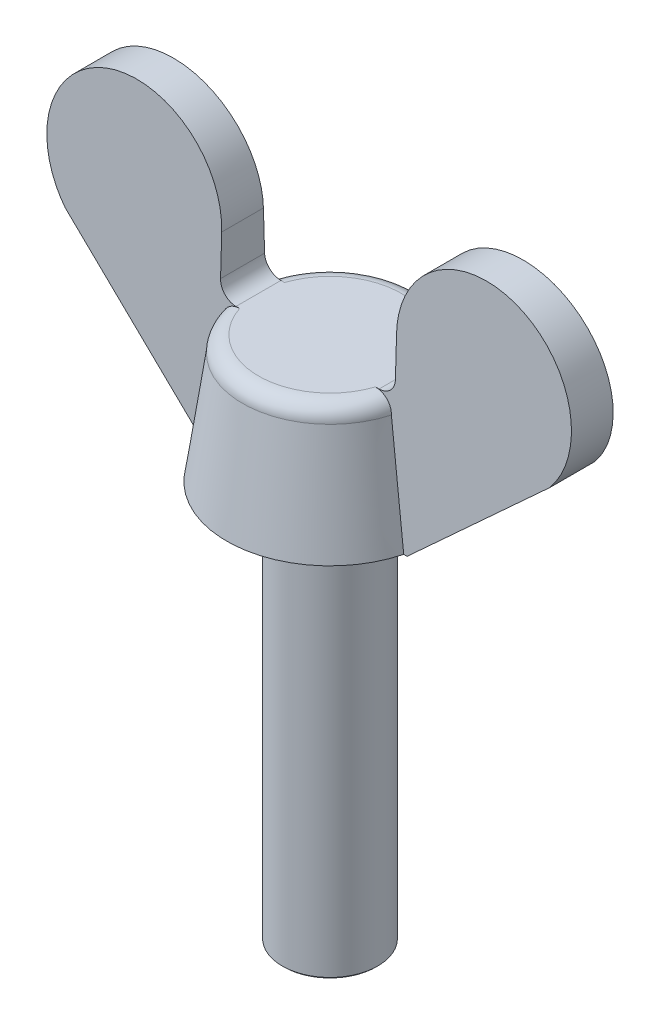
ISO-10303-21;
HEADER;
FILE_DESCRIPTION(('STEP AP214'),'2;1');
FILE_NAME('part.step','',(''),(''),'','','');
FILE_SCHEMA(('AUTOMOTIVE_DESIGN { 1 0 10303 214 1 1 1 1 }'));
ENDSEC;
DATA;
#1=APPLICATION_CONTEXT('core data for automotive mechanical design processes');
#2=APPLICATION_PROTOCOL_DEFINITION('international standard','automotive_design',2000,#1);
#3=PRODUCT_CONTEXT('',#1,'mechanical');
#4=PRODUCT('Part','Part','',(#3));
#5=PRODUCT_RELATED_PRODUCT_CATEGORY('part','',(#4));
#6=PRODUCT_DEFINITION_FORMATION('','',#4);
#7=PRODUCT_DEFINITION_CONTEXT('part definition',#1,'design');
#8=PRODUCT_DEFINITION('design','',#6,#7);
#9=PRODUCT_DEFINITION_SHAPE('','',#8);
#10=(LENGTH_UNIT() NAMED_UNIT(*) SI_UNIT(.MILLI.,.METRE.));
#11=(NAMED_UNIT(*) PLANE_ANGLE_UNIT() SI_UNIT($,.RADIAN.));
#12=(NAMED_UNIT(*) SI_UNIT($,.STERADIAN.) SOLID_ANGLE_UNIT());
#13=UNCERTAINTY_MEASURE_WITH_UNIT(LENGTH_MEASURE(1.E-05),#10,'distance_accuracy_value','');
#14=(GEOMETRIC_REPRESENTATION_CONTEXT(3) GLOBAL_UNCERTAINTY_ASSIGNED_CONTEXT((#13)) GLOBAL_UNIT_ASSIGNED_CONTEXT((#10,
#11,#12)) REPRESENTATION_CONTEXT('',''));
#15=CARTESIAN_POINT('',(0.,0.,0.));
#16=DIRECTION('',(0.,0.,1.));
#17=DIRECTION('',(1.,0.,0.));
#18=AXIS2_PLACEMENT_3D('',#15,#16,#17);
#19=CARTESIAN_POINT('',(81.,0.,1.65));
#20=DIRECTION('',(0.,0.0293990516018927,0.999567754464353));
#21=DIRECTION('',(0.,-0.999567754464353,0.0293990516018927));
#22=AXIS2_PLACEMENT_3D('',#19,#20,#21);
#23=PLANE('',#22);
#24=CARTESIAN_POINT('',(3.1881824558515,6.9998,1.44412352941176));
#25=CARTESIAN_POINT('',(3.18853224174816,7.02661716749052,1.44333478919146));
#26=CARTESIAN_POINT('',(3.19006951417628,7.05340413208405,1.44254693729165));
#27=CARTESIAN_POINT('',(3.19547818428535,7.10673208554267,1.44097846807227));
#28=CARTESIAN_POINT('',(3.19934873578166,7.13327316004062,1.4401978482341));
#29=CARTESIAN_POINT('',(3.21435482144723,7.2120374101705,1.43788125264204));
#30=CARTESIAN_POINT('',(3.22888882277439,7.26365033539848,1.43636322542946));
#31=CARTESIAN_POINT('',(3.26629673931846,7.36364973405854,1.43342206664534));
#32=CARTESIAN_POINT('',(3.28916221836342,7.41203941282269,1.43199884079933));
#33=CARTESIAN_POINT('',(3.34231369198613,7.50459257667373,1.42927668892136));
#34=CARTESIAN_POINT('',(3.37260551931192,7.54875270171744,1.42797786171419));
#35=CARTESIAN_POINT('',(3.44129227300287,7.63405013705859,1.42546911361592));
#36=CARTESIAN_POINT('',(3.48002264660304,7.67491695116253,1.42426714849522));
#37=CARTESIAN_POINT('',(3.56333822362803,7.75016710448419,1.42205390869164));
#38=CARTESIAN_POINT('',(3.60792512477359,7.78454855662392,1.42104268951106));
#39=CARTESIAN_POINT('',(3.70554533084808,7.84866897993424,1.41915679470782));
#40=CARTESIAN_POINT('',(3.75896919732957,7.87781491440561,1.41829956134101));
#41=CARTESIAN_POINT('',(3.86980716863923,7.92716021027062,1.41684822910969));
#42=CARTESIAN_POINT('',(3.92722225445927,7.94735736310653,1.41625419520275));
#43=CARTESIAN_POINT('',(4.0470686513781,7.97895274223393,1.41532491934606));
#44=CARTESIAN_POINT('',(4.1096094731295,7.9899382235106,1.41500181695557));
#45=CARTESIAN_POINT('',(4.23565815845193,8.00120184956041,1.41467053383646));
#46=CARTESIAN_POINT('',(4.299166066538,8.00147949995186,1.41466236764847));
#47=CARTESIAN_POINT('',(4.42493290631509,7.99115255189533,1.41496610141484));
#48=CARTESIAN_POINT('',(4.48719693086758,7.9806107480636,1.41527615446872));
#49=CARTESIAN_POINT('',(4.60892890647733,7.94880694123468,1.41621156055192));
#50=CARTESIAN_POINT('',(4.66839741390458,7.92754708132839,1.41683685054917));
#51=CARTESIAN_POINT('',(4.78038509640124,7.87573171784828,1.41836083182799));
#52=CARTESIAN_POINT('',(4.83308301014985,7.84556257183039,1.41924815965205));
#53=CARTESIAN_POINT('',(4.93232553203143,7.77640054192969,1.42128233700207));
#54=CARTESIAN_POINT('',(4.97887216203762,7.73741056886024,1.42242910091588));
#55=CARTESIAN_POINT('',(5.06218311947123,7.65369279417373,1.42489138840666));
#56=CARTESIAN_POINT('',(5.09930292225529,7.60931824942709,1.42619652207567));
#57=CARTESIAN_POINT('',(5.16522696481788,7.51474868299915,1.42897797991179));
#58=CARTESIAN_POINT('',(5.1940303029339,7.46455303102571,1.43045432261689));
#59=CARTESIAN_POINT('',(5.24141435704506,7.36179948746624,1.43347648566276));
#60=CARTESIAN_POINT('',(5.2603315691564,7.30939598820326,1.43501776505285));
#61=CARTESIAN_POINT('',(5.28886385190192,7.20216858984727,1.43817151206332));
#62=CARTESIAN_POINT('',(5.29849545162545,7.14734917391371,1.43978384782607));
#63=CARTESIAN_POINT('',(5.30470289489283,7.07681917653468,1.44185825951369));
#64=CARTESIAN_POINT('',(5.30568481702064,7.06141908239086,1.44231120345909));
#65=CARTESIAN_POINT('',(5.30690771320516,7.03061370516241,1.44321724396581));
#66=CARTESIAN_POINT('',(5.30714984755576,7.01520846814245,1.44367033917228));
#67=CARTESIAN_POINT('',(5.30702430857438,6.9998,1.44412352941176));
#68=B_SPLINE_CURVE_WITH_KNOTS('',3,(#24,#25,#26,#27,#28,#29,#30,#31,#32,#33,#34,#35,#36,#37,#38,
#39,#40,#41,#42,#43,#44,#45,#46,#47,#48,#49,#50,#51,#52,#53,#54,#55,#56,#57,#58,#59,#60,#61,#62,
#63,#64,#65,#66,#67),.UNSPECIFIED.,.F.,.F.,(4,2,2,2,2,2,2,2,2,2,2,2,2,2,2,2,2,2,2,2,2,4),(0.,
0.0804388261072363,0.16084849788538,0.320931392023232,0.480852640066109,0.64089989695626,
0.809140830086143,0.977430641855624,1.15921011888466,1.34103443410065,1.53062619943046,
1.72022671822182,1.90873301050127,2.09720162561377,2.27846658500375,2.45967181520641,
2.63240959511594,2.80516609605091,2.97157985926963,3.1376968434859,3.18399950755751,
3.2302295124811),.UNSPECIFIED.);
#69=CARTESIAN_POINT('',(4.27183886241464,8.,1.41470588235294));
#70=VERTEX_POINT('',#69);
#71=CARTESIAN_POINT('',(5.30702592997747,7.,1.44411764705882));
#72=VERTEX_POINT('',#71);
#73=EDGE_CURVE('E258',#70,#72,#68,.T.);
#74=ORIENTED_EDGE('',*,*,#73,.T.);
#75=CARTESIAN_POINT('',(5.30699792030674,7.0002,1.44411176470588));
#76=CARTESIAN_POINT('',(5.47039233239155,5.83347241255833,1.47842728198358));
#77=CARTESIAN_POINT('',(5.63376620691693,4.66674195215578,1.51274288376012));
#78=CARTESIAN_POINT('',(5.96047288084039,2.33327528548912,1.58137425630914));
#79=CARTESIAN_POINT('',(6.12380568023849,1.166539079225,1.61569002708162));
#80=CARTESIAN_POINT('',(6.28711794207715,-0.000200000000000021,1.65000588235294));
#81=B_SPLINE_CURVE_WITH_KNOTS('',3,(#75,#76,#77,#78,#79,#80),.UNSPECIFIED.,.F.,.F.,(4,2,4),(0.,
3.53583893237585,7.07167786456925),.UNSPECIFIED.);
#82=CARTESIAN_POINT('',(6.28708994686731,0.,1.65));
#83=VERTEX_POINT('',#82);
#84=EDGE_CURVE('E281',#72,#83,#81,.T.);
#85=ORIENTED_EDGE('',*,*,#84,.T.);
#86=DIRECTION('',(1.,0.,0.));
#87=VECTOR('',#86,1.);
#88=CARTESIAN_POINT('',(-6.5,0.,1.65));
#89=LINE('',#88,#87);
#90=CARTESIAN_POINT('',(6.50000000000001,0.,1.65));
#91=VERTEX_POINT('',#90);
#92=EDGE_CURVE('E188',#83,#91,#89,.T.);
#93=ORIENTED_EDGE('',*,*,#92,.T.);
#94=DIRECTION('',(-0.737600612967388,-0.674945375764199,0.0198513345813));
#95=VECTOR('',#94,1.);
#96=CARTESIAN_POINT('',(6.54831977663278,0.0442152693787079,1.64869955090063));
#97=LINE('',#96,#95);
#98=CARTESIAN_POINT('',(15.2426406871193,8.,1.41470588235294));
#99=VERTEX_POINT('',#98);
#100=EDGE_CURVE('E288',#99,#91,#97,.T.);
#101=ORIENTED_EDGE('',*,*,#100,.F.);
#102=CARTESIAN_POINT('',(11.,11.5,1.31176470588235));
#103=DIRECTION('',(0.,0.0293990516018927,0.999567754464353));
#104=DIRECTION('',(0.,-0.999567754464353,0.0293990516018927));
#105=AXIS2_PLACEMENT_3D('',#102,#103,#104);
#106=ELLIPSE('',#105,5.50237837848954,5.5);
#107=CARTESIAN_POINT('',(5.5,11.5,1.31176470588235));
#108=VERTEX_POINT('',#107);
#109=EDGE_CURVE('E291',#108,#99,#106,.F.);
#110=ORIENTED_EDGE('',*,*,#109,.F.);
#111=DIRECTION('',(0.,0.999567754464353,-0.0293990516018927));
#112=VECTOR('',#111,1.);
#113=CARTESIAN_POINT('',(5.5,9.08919619706137,1.38267070008643));
#114=LINE('',#113,#112);
#115=CARTESIAN_POINT('',(5.5,9.,1.38529411764706));
#116=VERTEX_POINT('',#115);
#117=EDGE_CURVE('E293',#116,#108,#114,.T.);
#118=ORIENTED_EDGE('',*,*,#117,.F.);
#119=CARTESIAN_POINT('',(4.5,9.,1.38529411764706));
#120=DIRECTION('',(0.,0.0293990516018927,0.999567754464353));
#121=DIRECTION('',(0.,-0.999567754464353,0.0293990516018927));
#122=AXIS2_PLACEMENT_3D('',#119,#120,#121);
#123=ELLIPSE('',#122,1.00043243245264,1.);
#124=CARTESIAN_POINT('',(4.5,8.,1.41470588235294));
#125=VERTEX_POINT('',#124);
#126=EDGE_CURVE('E296',#125,#116,#123,.T.);
#127=ORIENTED_EDGE('',*,*,#126,.F.);
#128=DIRECTION('',(1.,0.,0.));
#129=VECTOR('',#128,1.);
#130=CARTESIAN_POINT('',(-4.5,8.,1.41470588235294));
#131=LINE('',#130,#129);
#132=EDGE_CURVE('E299',#70,#125,#131,.T.);
#133=ORIENTED_EDGE('',*,*,#132,.F.);
#134=EDGE_LOOP('',(#74,#85,#93,#101,#110,#118,#127,#133));
#135=FACE_BOUND('',#134,.T.);
#136=ADVANCED_FACE('F35',(#135),#23,.T.);
#137=CARTESIAN_POINT('',(-6.5,0.,1.65));
#138=VERTEX_POINT('',#137);
#139=CARTESIAN_POINT('',(-6.28708994686731,0.,1.65));
#140=VERTEX_POINT('',#139);
#141=EDGE_CURVE('E189',#138,#140,#89,.T.);
#142=ORIENTED_EDGE('',*,*,#141,.T.);
#143=CARTESIAN_POINT('',(-6.28711794207715,-0.000199999999999969,1.65000588235294));
#144=CARTESIAN_POINT('',(-6.12380568023849,1.166539079225,1.61569002708162));
#145=CARTESIAN_POINT('',(-5.96047288084039,2.33327528548912,1.58137425630914));
#146=CARTESIAN_POINT('',(-5.63376620691693,4.66674195215578,1.51274288376012));
#147=CARTESIAN_POINT('',(-5.47039233239155,5.83347241255833,1.47842728198358));
#148=CARTESIAN_POINT('',(-5.30699792030674,7.0002,1.44411176470588));
#149=B_SPLINE_CURVE_WITH_KNOTS('',3,(#143,#144,#145,#146,#147,#148),.UNSPECIFIED.,.F.,.F.,(4,2,
4),(0.,3.5358389321934,7.07167786456925),.UNSPECIFIED.);
#150=CARTESIAN_POINT('',(-5.30702592997747,7.,1.44411764705882));
#151=VERTEX_POINT('',#150);
#152=EDGE_CURVE('E275',#140,#151,#149,.T.);
#153=ORIENTED_EDGE('',*,*,#152,.T.);
#154=CARTESIAN_POINT('',(-5.30702430857437,6.9998,1.44412352941176));
#155=CARTESIAN_POINT('',(-5.30724822155936,7.02704538757067,1.44332219448322));
#156=CARTESIAN_POINT('',(-5.30631675640262,7.05428730053191,1.44252096174906));
#157=CARTESIAN_POINT('',(-5.30215313245408,7.10859283033787,1.44092374028418));
#158=CARTESIAN_POINT('',(-5.29892114294335,7.13565646015346,1.44012775117196));
#159=CARTESIAN_POINT('',(-5.28580882617285,7.21620885316993,1.43775856314206));
#160=CARTESIAN_POINT('',(-5.27251303868963,7.26918232440762,1.43620051987036));
#161=CARTESIAN_POINT('',(-5.23721711692032,7.37213445454747,1.43317251604272));
#162=CARTESIAN_POINT('',(-5.21521400842853,7.42211208342026,1.43170258578176));
#163=CARTESIAN_POINT('',(-5.16319799136727,7.51770998396949,1.42889088282443));
#164=CARTESIAN_POINT('',(-5.13318557936404,7.56333052554158,1.42754910218995));
#165=CARTESIAN_POINT('',(-5.06577669444156,7.64940141902572,1.42501760532277));
#166=CARTESIAN_POINT('',(-5.02831669827438,7.68980198330832,1.42382935343211));
#167=CARTESIAN_POINT('',(-4.94731187498472,7.76396696770423,1.42164803036164));
#168=CARTESIAN_POINT('',(-4.90376553285838,7.79772973049491,1.42065500792662));
#169=CARTESIAN_POINT('',(-4.81047616677419,7.85875716816322,1.41886008328932));
#170=CARTESIAN_POINT('',(-4.76058769401038,7.885799493697,1.41806472077362));
#171=CARTESIAN_POINT('',(-4.65711708084103,7.93150892892624,1.41672032561982));
#172=CARTESIAN_POINT('',(-4.60353450704509,7.95017505399379,1.41617132194136));
#173=CARTESIAN_POINT('',(-4.49179645775212,7.97945147477945,1.41531025074178));
#174=CARTESIAN_POINT('',(-4.43354343359439,7.98968956916843,1.41500913031858));
#175=CARTESIAN_POINT('',(-4.31614921230927,8.00069462501283,1.41468545220551));
#176=CARTESIAN_POINT('',(-4.25700779401487,8.00145918754204,1.41466296507229));
#177=CARTESIAN_POINT('',(-4.13673640479075,7.99348366301109,1.4148975393232));
#178=CARTESIAN_POINT('',(-4.07563432537529,7.98432125529662,1.41516702190304));
#179=CARTESIAN_POINT('',(-3.95573289416396,7.95617384162972,1.41599488701089));
#180=CARTESIAN_POINT('',(-3.89693403725041,7.93718673701054,1.4165533312644));
#181=CARTESIAN_POINT('',(-3.78157160150186,7.88921661446734,1.41796421722155));
#182=CARTESIAN_POINT('',(-3.72512051683333,7.85996249676563,1.41882463244807));
#183=CARTESIAN_POINT('',(-3.61798807915165,7.79229850880247,1.4208147497411));
#184=CARTESIAN_POINT('',(-3.56730698690792,7.75388822497918,1.4219444639712));
#185=CARTESIAN_POINT('',(-3.47395920784869,7.66930169788755,1.42443230300331));
#186=CARTESIAN_POINT('',(-3.43120608840716,7.62322106941652,1.4257876156054));
#187=CARTESIAN_POINT('',(-3.35466702951857,7.52408944666755,1.4287032515686));
#188=CARTESIAN_POINT('',(-3.32088087932315,7.4710386162523,1.43026357011023));
#189=CARTESIAN_POINT('',(-3.26576436032925,7.3631026788941,1.43343815650311));
#190=CARTESIAN_POINT('',(-3.24377286299784,7.30855475832377,1.43504250710812));
#191=CARTESIAN_POINT('',(-3.21029384759147,7.19639772130702,1.43834124349097));
#192=CARTESIAN_POINT('',(-3.19877796820996,7.13879731974358,1.44003537294872));
#193=CARTESIAN_POINT('',(-3.19146578562629,7.06727689657053,1.44213891480675));
#194=CARTESIAN_POINT('',(-3.19038960167874,7.05379380081313,1.44253547644667));
#195=CARTESIAN_POINT('',(-3.18883739326996,7.02681031623936,1.4433291083459));
#196=CARTESIAN_POINT('',(-3.18836060789386,7.01330997117073,1.44372617731851));
#197=CARTESIAN_POINT('',(-3.1881824558515,6.9998,1.44412352941176));
#198=B_SPLINE_CURVE_WITH_KNOTS('',3,(#154,#155,#156,#157,#158,#159,#160,#161,#162,#163,#164,
#165,#166,#167,#168,#169,#170,#171,#172,#173,#174,#175,#176,#177,#178,#179,#180,#181,#182,#183,
#184,#185,#186,#187,#188,#189,#190,#191,#192,#193,#194,#195,#196,#197),.UNSPECIFIED.,.F.,.F.,(4,
2,2,2,2,2,2,2,2,2,2,2,2,2,2,2,2,2,2,2,2,4),(0.,0.0817239877248246,0.163441962518638,
0.326512880593391,0.489639547809173,0.652756103735729,0.817328740779631,0.981942416190454,
1.15143687609292,1.32095125496548,1.4976016061514,1.67429668854283,1.8588150110601,
2.04337276506642,2.23322435412281,2.42308451994091,2.61073438818908,2.7983798457601,
2.9739617757746,3.14906691449766,3.1896547332393,3.23019097500923),.UNSPECIFIED.);
#199=CARTESIAN_POINT('',(-4.27183886241464,8.,1.41470588235294));
#200=VERTEX_POINT('',#199);
#201=EDGE_CURVE('E251',#151,#200,#198,.T.);
#202=ORIENTED_EDGE('',*,*,#201,.T.);
#203=CARTESIAN_POINT('',(-4.5,8.,1.41470588235294));
#204=VERTEX_POINT('',#203);
#205=EDGE_CURVE('E300',#204,#200,#131,.T.);
#206=ORIENTED_EDGE('',*,*,#205,.F.);
#207=CARTESIAN_POINT('',(-4.5,9.,1.38529411764706));
#208=DIRECTION('',(0.,0.0293990516018927,0.999567754464353));
#209=DIRECTION('',(0.,-0.999567754464353,0.0293990516018927));
#210=AXIS2_PLACEMENT_3D('',#207,#208,#209);
#211=ELLIPSE('',#210,1.00043243245264,1.);
#212=CARTESIAN_POINT('',(-5.5,9.,1.38529411764706));
#213=VERTEX_POINT('',#212);
#214=EDGE_CURVE('E302',#213,#204,#211,.T.);
#215=ORIENTED_EDGE('',*,*,#214,.F.);
#216=DIRECTION('',(0.,-0.999567754464353,0.0293990516018927));
#217=VECTOR('',#216,1.);
#218=CARTESIAN_POINT('',(-5.5,9.08919619706137,1.38267070008643));
#219=LINE('',#218,#217);
#220=CARTESIAN_POINT('',(-5.5,11.5,1.31176470588235));
#221=VERTEX_POINT('',#220);
#222=EDGE_CURVE('E305',#221,#213,#219,.T.);
#223=ORIENTED_EDGE('',*,*,#222,.F.);
#224=CARTESIAN_POINT('',(-11.,11.5,1.31176470588235));
#225=DIRECTION('',(0.,0.0293990516018927,0.999567754464353));
#226=DIRECTION('',(0.,-0.999567754464353,0.0293990516018927));
#227=AXIS2_PLACEMENT_3D('',#224,#225,#226);
#228=ELLIPSE('',#227,5.50237837848954,5.5);
#229=CARTESIAN_POINT('',(-15.2426406871193,8.00000000000001,1.41470588235294));
#230=VERTEX_POINT('',#229);
#231=EDGE_CURVE('E308',#230,#221,#228,.F.);
#232=ORIENTED_EDGE('',*,*,#231,.F.);
#233=DIRECTION('',(-0.737600612967388,0.674945375764199,-0.0198513345813));
#234=VECTOR('',#233,1.);
#235=CARTESIAN_POINT('',(-6.54831977663278,0.0442152693787079,1.64869955090063));
#236=LINE('',#235,#234);
#237=EDGE_CURVE('E310',#138,#230,#236,.T.);
#238=ORIENTED_EDGE('',*,*,#237,.F.);
#239=EDGE_LOOP('',(#142,#153,#202,#206,#215,#223,#232,#238));
#240=FACE_BOUND('',#239,.T.);
#241=ADVANCED_FACE('F269',(#240),#23,.T.);
#242=CARTESIAN_POINT('',(81.,0.,-1.65));
#243=DIRECTION('',(0.,0.0293990516018927,-0.999567754464353));
#244=DIRECTION('',(0.,0.999567754464353,0.0293990516018927));
#245=AXIS2_PLACEMENT_3D('',#242,#243,#244);
#246=PLANE('',#245);
#247=DIRECTION('',(1.,0.,0.));
#248=VECTOR('',#247,1.);
#249=CARTESIAN_POINT('',(-6.5,0.,-1.65));
#250=LINE('',#249,#248);
#251=CARTESIAN_POINT('',(6.28708994686731,0.,-1.65));
#252=VERTEX_POINT('',#251);
#253=CARTESIAN_POINT('',(6.5,0.,-1.65));
#254=VERTEX_POINT('',#253);
#255=EDGE_CURVE('E192',#252,#254,#250,.T.);
#256=ORIENTED_EDGE('',*,*,#255,.F.);
#257=CARTESIAN_POINT('',(6.28711794207715,-0.000199999999999969,-1.65000588235294));
#258=CARTESIAN_POINT('',(6.12380568023849,1.166539079225,-1.61569002708162));
#259=CARTESIAN_POINT('',(5.96047288084039,2.33327528548912,-1.58137425630914));
#260=CARTESIAN_POINT('',(5.63376620691693,4.66674195215578,-1.51274288376012));
#261=CARTESIAN_POINT('',(5.47039233239155,5.83347241255833,-1.47842728198358));
#262=CARTESIAN_POINT('',(5.30699792030674,7.0002,-1.44411176470588));
#263=B_SPLINE_CURVE_WITH_KNOTS('',3,(#257,#258,#259,#260,#261,#262),.UNSPECIFIED.,.F.,.F.,(4,2,
4),(0.,3.5358389321934,7.07167786456925),.UNSPECIFIED.);
#264=CARTESIAN_POINT('',(5.30702592997747,7.,-1.44411764705882));
#265=VERTEX_POINT('',#264);
#266=EDGE_CURVE('E11',#252,#265,#263,.T.);
#267=ORIENTED_EDGE('',*,*,#266,.T.);
#268=CARTESIAN_POINT('',(5.30702430857437,6.9998,-1.44412352941176));
#269=CARTESIAN_POINT('',(5.30724822155936,7.02704538757067,-1.44332219448322));
#270=CARTESIAN_POINT('',(5.30631675640262,7.05428730053191,-1.44252096174906));
#271=CARTESIAN_POINT('',(5.30215313245408,7.10859283033787,-1.44092374028418));
#272=CARTESIAN_POINT('',(5.29892114294335,7.13565646015346,-1.44012775117196));
#273=CARTESIAN_POINT('',(5.28580882617285,7.21620885316993,-1.43775856314206));
#274=CARTESIAN_POINT('',(5.27251303868963,7.26918232440762,-1.43620051987036));
#275=CARTESIAN_POINT('',(5.23721711692032,7.37213445454747,-1.43317251604272));
#276=CARTESIAN_POINT('',(5.21521400842853,7.42211208342026,-1.43170258578176));
#277=CARTESIAN_POINT('',(5.16319799136727,7.51770998396949,-1.42889088282443));
#278=CARTESIAN_POINT('',(5.13318557936404,7.56333052554158,-1.42754910218995));
#279=CARTESIAN_POINT('',(5.06577669444156,7.64940141902572,-1.42501760532277));
#280=CARTESIAN_POINT('',(5.02831669827438,7.68980198330832,-1.42382935343211));
#281=CARTESIAN_POINT('',(4.94731187498472,7.76396696770423,-1.42164803036164));
#282=CARTESIAN_POINT('',(4.90376553285838,7.79772973049491,-1.42065500792662));
#283=CARTESIAN_POINT('',(4.81047616677419,7.85875716816322,-1.41886008328932));
#284=CARTESIAN_POINT('',(4.76058769401038,7.885799493697,-1.41806472077362));
#285=CARTESIAN_POINT('',(4.65711708084103,7.93150892892624,-1.41672032561982));
#286=CARTESIAN_POINT('',(4.60353450704509,7.95017505399379,-1.41617132194136));
#287=CARTESIAN_POINT('',(4.49179645775212,7.97945147477945,-1.41531025074178));
#288=CARTESIAN_POINT('',(4.43354343359439,7.98968956916843,-1.41500913031858));
#289=CARTESIAN_POINT('',(4.31614921230927,8.00069462501283,-1.41468545220551));
#290=CARTESIAN_POINT('',(4.25700779401487,8.00145918754204,-1.41466296507229));
#291=CARTESIAN_POINT('',(4.13673640479075,7.99348366301109,-1.4148975393232));
#292=CARTESIAN_POINT('',(4.07563432537529,7.98432125529662,-1.41516702190304));
#293=CARTESIAN_POINT('',(3.95573289416396,7.95617384162972,-1.41599488701089));
#294=CARTESIAN_POINT('',(3.89693403725041,7.93718673701054,-1.4165533312644));
#295=CARTESIAN_POINT('',(3.78157160150186,7.88921661446734,-1.41796421722155));
#296=CARTESIAN_POINT('',(3.72512051683333,7.85996249676563,-1.41882463244807));
#297=CARTESIAN_POINT('',(3.61798807915165,7.79229850880247,-1.4208147497411));
#298=CARTESIAN_POINT('',(3.56730698690792,7.75388822497918,-1.4219444639712));
#299=CARTESIAN_POINT('',(3.47395920784869,7.66930169788755,-1.42443230300331));
#300=CARTESIAN_POINT('',(3.43120608840716,7.62322106941652,-1.4257876156054));
#301=CARTESIAN_POINT('',(3.35466702951857,7.52408944666755,-1.4287032515686));
#302=CARTESIAN_POINT('',(3.32088087932315,7.4710386162523,-1.43026357011023));
#303=CARTESIAN_POINT('',(3.26576436032925,7.3631026788941,-1.43343815650311));
#304=CARTESIAN_POINT('',(3.24377286299784,7.30855475832377,-1.43504250710812));
#305=CARTESIAN_POINT('',(3.21029384759147,7.19639772130702,-1.43834124349097));
#306=CARTESIAN_POINT('',(3.19877796820996,7.13879731974358,-1.44003537294872));
#307=CARTESIAN_POINT('',(3.19146578562629,7.06727689657053,-1.44213891480675));
#308=CARTESIAN_POINT('',(3.19038960167874,7.05379380081313,-1.44253547644667));
#309=CARTESIAN_POINT('',(3.18883739326996,7.02681031623936,-1.4433291083459));
#310=CARTESIAN_POINT('',(3.18836060789386,7.01330997117073,-1.44372617731851));
#311=CARTESIAN_POINT('',(3.1881824558515,6.9998,-1.44412352941176));
#312=B_SPLINE_CURVE_WITH_KNOTS('',3,(#268,#269,#270,#271,#272,#273,#274,#275,#276,#277,#278,
#279,#280,#281,#282,#283,#284,#285,#286,#287,#288,#289,#290,#291,#292,#293,#294,#295,#296,#297,
#298,#299,#300,#301,#302,#303,#304,#305,#306,#307,#308,#309,#310,#311),.UNSPECIFIED.,.F.,.F.,(4,
2,2,2,2,2,2,2,2,2,2,2,2,2,2,2,2,2,2,2,2,4),(0.,0.0817239877248246,0.163441962518638,
0.326512880593391,0.489639547809173,0.652756103735729,0.817328740779631,0.981942416190454,
1.15143687609292,1.32095125496548,1.4976016061514,1.67429668854283,1.8588150110601,
2.04337276506642,2.23322435412281,2.42308451994091,2.61073438818908,2.7983798457601,
2.9739617757746,3.14906691449766,3.1896547332393,3.23019097500923),.UNSPECIFIED.);
#313=CARTESIAN_POINT('',(4.27183886241464,8.,-1.41470588235294));
#314=VERTEX_POINT('',#313);
#315=EDGE_CURVE('E49',#265,#314,#312,.T.);
#316=ORIENTED_EDGE('',*,*,#315,.T.);
#317=DIRECTION('',(-1.,0.,0.));
#318=VECTOR('',#317,1.);
#319=CARTESIAN_POINT('',(-4.5,8.,-1.41470588235294));
#320=LINE('',#319,#318);
#321=CARTESIAN_POINT('',(4.5,8.,-1.41470588235294));
#322=VERTEX_POINT('',#321);
#323=EDGE_CURVE('E164',#322,#314,#320,.T.);
#324=ORIENTED_EDGE('',*,*,#323,.F.);
#325=CARTESIAN_POINT('',(4.5,9.,-1.38529411764706));
#326=DIRECTION('',(0.,0.0293990516018927,-0.999567754464353));
#327=DIRECTION('',(0.,0.999567754464353,0.0293990516018927));
#328=AXIS2_PLACEMENT_3D('',#325,#326,#327);
#329=ELLIPSE('',#328,1.00043243245264,1.);
#330=CARTESIAN_POINT('',(5.5,9.,-1.38529411764706));
#331=VERTEX_POINT('',#330);
#332=EDGE_CURVE('E176',#331,#322,#329,.T.);
#333=ORIENTED_EDGE('',*,*,#332,.F.);
#334=DIRECTION('',(0.,-0.999567754464353,-0.0293990516018927));
#335=VECTOR('',#334,1.);
#336=CARTESIAN_POINT('',(5.5,8.99222126188418,-1.38552290406223));
#337=LINE('',#336,#335);
#338=CARTESIAN_POINT('',(5.5,11.5,-1.31176470588235));
#339=VERTEX_POINT('',#338);
#340=EDGE_CURVE('E317',#339,#331,#337,.T.);
#341=ORIENTED_EDGE('',*,*,#340,.F.);
#342=CARTESIAN_POINT('',(11.,11.5,-1.31176470588235));
#343=DIRECTION('',(0.,0.0293990516018927,-0.999567754464353));
#344=DIRECTION('',(0.,0.999567754464353,0.0293990516018927));
#345=AXIS2_PLACEMENT_3D('',#342,#343,#344);
#346=ELLIPSE('',#345,5.50237837848954,5.5);
#347=CARTESIAN_POINT('',(15.2426406871193,8.,-1.41470588235294));
#348=VERTEX_POINT('',#347);
#349=EDGE_CURVE('E316',#348,#339,#346,.F.);
#350=ORIENTED_EDGE('',*,*,#349,.F.);
#351=DIRECTION('',(0.737600612967388,0.674945375764199,0.0198513345813));
#352=VECTOR('',#351,1.);
#353=CARTESIAN_POINT('',(6.5,0.,-1.65));
#354=LINE('',#353,#352);
#355=EDGE_CURVE('E313',#254,#348,#354,.T.);
#356=ORIENTED_EDGE('',*,*,#355,.F.);
#357=EDGE_LOOP('',(#256,#267,#316,#324,#333,#341,#350,#356));
#358=FACE_BOUND('',#357,.T.);
#359=ADVANCED_FACE('F163',(#358),#246,.T.);
#360=CARTESIAN_POINT('',(-3.1881824558515,6.9998,-1.44412352941176));
#361=CARTESIAN_POINT('',(-3.18853224174816,7.02661716749052,-1.44333478919146));
#362=CARTESIAN_POINT('',(-3.19006951417628,7.05340413208405,-1.44254693729165));
#363=CARTESIAN_POINT('',(-3.19547818428535,7.10673208554267,-1.44097846807227));
#364=CARTESIAN_POINT('',(-3.19934873578166,7.13327316004062,-1.4401978482341));
#365=CARTESIAN_POINT('',(-3.21435482144723,7.2120374101705,-1.43788125264204));
#366=CARTESIAN_POINT('',(-3.22888882277439,7.26365033539848,-1.43636322542946));
#367=CARTESIAN_POINT('',(-3.26629673931846,7.36364973405854,-1.43342206664534));
#368=CARTESIAN_POINT('',(-3.28916221836342,7.41203941282269,-1.43199884079933));
#369=CARTESIAN_POINT('',(-3.34231369198613,7.50459257667373,-1.42927668892136));
#370=CARTESIAN_POINT('',(-3.37260551931192,7.54875270171744,-1.42797786171419));
#371=CARTESIAN_POINT('',(-3.44129227300287,7.63405013705859,-1.42546911361592));
#372=CARTESIAN_POINT('',(-3.48002264660304,7.67491695116253,-1.42426714849522));
#373=CARTESIAN_POINT('',(-3.56333822362803,7.75016710448419,-1.42205390869164));
#374=CARTESIAN_POINT('',(-3.60792512477359,7.78454855662392,-1.42104268951106));
#375=CARTESIAN_POINT('',(-3.70554533084808,7.84866897993424,-1.41915679470782));
#376=CARTESIAN_POINT('',(-3.75896919732957,7.87781491440561,-1.41829956134101));
#377=CARTESIAN_POINT('',(-3.86980716863923,7.92716021027062,-1.41684822910969));
#378=CARTESIAN_POINT('',(-3.92722225445927,7.94735736310653,-1.41625419520275));
#379=CARTESIAN_POINT('',(-4.0470686513781,7.97895274223393,-1.41532491934606));
#380=CARTESIAN_POINT('',(-4.1096094731295,7.9899382235106,-1.41500181695557));
#381=CARTESIAN_POINT('',(-4.23565815845193,8.00120184956041,-1.41467053383646));
#382=CARTESIAN_POINT('',(-4.299166066538,8.00147949995186,-1.41466236764847));
#383=CARTESIAN_POINT('',(-4.42493290631509,7.99115255189533,-1.41496610141484));
#384=CARTESIAN_POINT('',(-4.48719693086758,7.9806107480636,-1.41527615446872));
#385=CARTESIAN_POINT('',(-4.60892890647733,7.94880694123468,-1.41621156055192));
#386=CARTESIAN_POINT('',(-4.66839741390458,7.92754708132839,-1.41683685054917));
#387=CARTESIAN_POINT('',(-4.78038509640124,7.87573171784828,-1.41836083182799));
#388=CARTESIAN_POINT('',(-4.83308301014985,7.84556257183039,-1.41924815965205));
#389=CARTESIAN_POINT('',(-4.93232553203143,7.77640054192969,-1.42128233700207));
#390=CARTESIAN_POINT('',(-4.97887216203762,7.73741056886024,-1.42242910091588));
#391=CARTESIAN_POINT('',(-5.06218311947123,7.65369279417373,-1.42489138840666));
#392=CARTESIAN_POINT('',(-5.09930292225529,7.60931824942709,-1.42619652207567));
#393=CARTESIAN_POINT('',(-5.16522696481788,7.51474868299915,-1.42897797991179));
#394=CARTESIAN_POINT('',(-5.1940303029339,7.46455303102571,-1.43045432261689));
#395=CARTESIAN_POINT('',(-5.24141435704506,7.36179948746624,-1.43347648566276));
#396=CARTESIAN_POINT('',(-5.2603315691564,7.30939598820326,-1.43501776505285));
#397=CARTESIAN_POINT('',(-5.28886385190192,7.20216858984727,-1.43817151206332));
#398=CARTESIAN_POINT('',(-5.29849545162545,7.14734917391371,-1.43978384782607));
#399=CARTESIAN_POINT('',(-5.30470289489283,7.07681917653468,-1.44185825951369));
#400=CARTESIAN_POINT('',(-5.30568481702064,7.06141908239086,-1.44231120345909));
#401=CARTESIAN_POINT('',(-5.30690771320516,7.03061370516241,-1.44321724396581));
#402=CARTESIAN_POINT('',(-5.30714984755576,7.01520846814245,-1.44367033917228));
#403=CARTESIAN_POINT('',(-5.30702430857438,6.9998,-1.44412352941176));
#404=B_SPLINE_CURVE_WITH_KNOTS('',3,(#360,#361,#362,#363,#364,#365,#366,#367,#368,#369,#370,
#371,#372,#373,#374,#375,#376,#377,#378,#379,#380,#381,#382,#383,#384,#385,#386,#387,#388,#389,
#390,#391,#392,#393,#394,#395,#396,#397,#398,#399,#400,#401,#402,#403),.UNSPECIFIED.,.F.,.F.,(4,
2,2,2,2,2,2,2,2,2,2,2,2,2,2,2,2,2,2,2,2,4),(0.,0.0804388261072363,0.16084849788538,
0.320931392023232,0.480852640066109,0.64089989695626,0.809140830086143,0.977430641855624,
1.15921011888466,1.34103443410065,1.53062619943046,1.72022671822182,1.90873301050127,
2.09720162561377,2.27846658500375,2.45967181520641,2.63240959511594,2.80516609605091,
2.97157985926963,3.1376968434859,3.18399950755751,3.2302295124811),.UNSPECIFIED.);
#405=CARTESIAN_POINT('',(-4.27183886241464,8.,-1.41470588235294));
#406=VERTEX_POINT('',#405);
#407=CARTESIAN_POINT('',(-5.30702592997747,7.,-1.44411764705882));
#408=VERTEX_POINT('',#407);
#409=EDGE_CURVE('E157',#406,#408,#404,.T.);
#410=ORIENTED_EDGE('',*,*,#409,.T.);
#411=CARTESIAN_POINT('',(-5.30699792030674,7.0002,-1.44411176470588));
#412=CARTESIAN_POINT('',(-5.47039233239155,5.83347241255833,-1.47842728198358));
#413=CARTESIAN_POINT('',(-5.63376620691693,4.66674195215578,-1.51274288376012));
#414=CARTESIAN_POINT('',(-5.96047288084039,2.33327528548912,-1.58137425630914));
#415=CARTESIAN_POINT('',(-6.12380568023849,1.166539079225,-1.61569002708162));
#416=CARTESIAN_POINT('',(-6.28711794207715,-0.000200000000000021,-1.65000588235294));
#417=B_SPLINE_CURVE_WITH_KNOTS('',3,(#411,#412,#413,#414,#415,#416),.UNSPECIFIED.,.F.,.F.,(4,2,
4),(0.,3.53583893237585,7.07167786456925),.UNSPECIFIED.);
#418=CARTESIAN_POINT('',(-6.28708994686731,0.,-1.65));
#419=VERTEX_POINT('',#418);
#420=EDGE_CURVE('E166',#408,#419,#417,.T.);
#421=ORIENTED_EDGE('',*,*,#420,.T.);
#422=CARTESIAN_POINT('',(-6.49999999999999,0.,-1.65));
#423=VERTEX_POINT('',#422);
#424=EDGE_CURVE('E193',#423,#419,#250,.T.);
#425=ORIENTED_EDGE('',*,*,#424,.F.);
#426=DIRECTION('',(0.737600612967388,-0.674945375764199,-0.0198513345813));
#427=VECTOR('',#426,1.);
#428=CARTESIAN_POINT('',(-6.5,0.,-1.65));
#429=LINE('',#428,#427);
#430=CARTESIAN_POINT('',(-15.2426406871193,8.00000000000001,-1.41470588235294));
#431=VERTEX_POINT('',#430);
#432=EDGE_CURVE('E185',#431,#423,#429,.T.);
#433=ORIENTED_EDGE('',*,*,#432,.F.);
#434=CARTESIAN_POINT('',(-11.,11.5,-1.31176470588235));
#435=DIRECTION('',(0.,0.0293990516018927,-0.999567754464353));
#436=DIRECTION('',(0.,0.999567754464353,0.0293990516018927));
#437=AXIS2_PLACEMENT_3D('',#434,#435,#436);
#438=ELLIPSE('',#437,5.50237837848954,5.5);
#439=CARTESIAN_POINT('',(-5.5,11.5,-1.31176470588235));
#440=VERTEX_POINT('',#439);
#441=EDGE_CURVE('E182',#440,#431,#438,.F.);
#442=ORIENTED_EDGE('',*,*,#441,.F.);
#443=DIRECTION('',(0.,0.999567754464353,0.0293990516018927));
#444=VECTOR('',#443,1.);
#445=CARTESIAN_POINT('',(-5.5,8.99222126188418,-1.38552290406223));
#446=LINE('',#445,#444);
#447=CARTESIAN_POINT('',(-5.5,9.,-1.38529411764706));
#448=VERTEX_POINT('',#447);
#449=EDGE_CURVE('E174',#448,#440,#446,.T.);
#450=ORIENTED_EDGE('',*,*,#449,.F.);
#451=CARTESIAN_POINT('',(-4.5,9.,-1.38529411764706));
#452=DIRECTION('',(0.,0.0293990516018927,-0.999567754464353));
#453=DIRECTION('',(0.,0.999567754464353,0.0293990516018927));
#454=AXIS2_PLACEMENT_3D('',#451,#452,#453);
#455=ELLIPSE('',#454,1.00043243245264,1.);
#456=CARTESIAN_POINT('',(-4.5,8.,-1.41470588235294));
#457=VERTEX_POINT('',#456);
#458=EDGE_CURVE('E170',#457,#448,#455,.T.);
#459=ORIENTED_EDGE('',*,*,#458,.F.);
#460=EDGE_CURVE('E171',#406,#457,#320,.T.);
#461=ORIENTED_EDGE('',*,*,#460,.F.);
#462=EDGE_LOOP('',(#410,#421,#425,#433,#442,#450,#459,#461));
#463=FACE_BOUND('',#462,.T.);
#464=ADVANCED_FACE('F396',(#463),#246,.T.);
#465=CARTESIAN_POINT('',(-6.5,0.,-1.65));
#466=DIRECTION('',(-0.675078404796137,-0.737745991095786,0.));
#467=DIRECTION('',(0.737745991095786,-0.675078404796137,0.));
#468=AXIS2_PLACEMENT_3D('',#465,#466,#467);
#469=PLANE('',#468);
#470=DIRECTION('',(0.,0.,1.));
#471=VECTOR('',#470,1.);
#472=CARTESIAN_POINT('',(-6.5,0.,-1.65));
#473=LINE('',#472,#471);
#474=EDGE_CURVE('E197',#423,#138,#473,.T.);
#475=ORIENTED_EDGE('',*,*,#474,.T.);
#476=ORIENTED_EDGE('',*,*,#237,.T.);
#477=DIRECTION('',(0.,0.,1.));
#478=VECTOR('',#477,1.);
#479=CARTESIAN_POINT('',(-15.2426406871193,8.00000000000001,-1.65));
#480=LINE('',#479,#478);
#481=EDGE_CURVE('E199',#431,#230,#480,.T.);
#482=ORIENTED_EDGE('',*,*,#481,.F.);
#483=ORIENTED_EDGE('',*,*,#432,.T.);
#484=EDGE_LOOP('',(#475,#476,#482,#483));
#485=FACE_BOUND('',#484,.T.);
#486=ADVANCED_FACE('F391',(#485),#469,.T.);
#487=CARTESIAN_POINT('',(-11.,11.5,-1.65));
#488=DIRECTION('',(0.,0.,1.));
#489=DIRECTION('',(1.,0.,0.));
#490=AXIS2_PLACEMENT_3D('',#487,#488,#489);
#491=CYLINDRICAL_SURFACE('',#490,5.5);
#492=ORIENTED_EDGE('',*,*,#231,.T.);
#493=DIRECTION('',(0.,0.,1.));
#494=VECTOR('',#493,1.);
#495=CARTESIAN_POINT('',(-5.5,11.5,-1.65));
#496=LINE('',#495,#494);
#497=EDGE_CURVE('E202',#440,#221,#496,.T.);
#498=ORIENTED_EDGE('',*,*,#497,.F.);
#499=ORIENTED_EDGE('',*,*,#441,.T.);
#500=ORIENTED_EDGE('',*,*,#481,.T.);
#501=EDGE_LOOP('',(#492,#498,#499,#500));
#502=FACE_BOUND('',#501,.T.);
#503=ADVANCED_FACE('F393',(#502),#491,.T.);
#504=CARTESIAN_POINT('',(-5.5,9.,-1.65));
#505=DIRECTION('',(1.,0.,0.));
#506=DIRECTION('',(0.,0.,-1.));
#507=AXIS2_PLACEMENT_3D('',#504,#505,#506);
#508=PLANE('',#507);
#509=ORIENTED_EDGE('',*,*,#497,.T.);
#510=ORIENTED_EDGE('',*,*,#222,.T.);
#511=DIRECTION('',(0.,0.,1.));
#512=VECTOR('',#511,1.);
#513=CARTESIAN_POINT('',(-5.5,9.,-1.65));
#514=LINE('',#513,#512);
#515=EDGE_CURVE('E205',#448,#213,#514,.T.);
#516=ORIENTED_EDGE('',*,*,#515,.F.);
#517=ORIENTED_EDGE('',*,*,#449,.T.);
#518=EDGE_LOOP('',(#509,#510,#516,#517));
#519=FACE_BOUND('',#518,.T.);
#520=ADVANCED_FACE('F400',(#519),#508,.T.);
#521=CARTESIAN_POINT('',(-4.5,9.,-1.65));
#522=DIRECTION('',(0.,0.,1.));
#523=DIRECTION('',(1.,0.,0.));
#524=AXIS2_PLACEMENT_3D('',#521,#522,#523);
#525=CYLINDRICAL_SURFACE('',#524,1.);
#526=ORIENTED_EDGE('',*,*,#515,.T.);
#527=ORIENTED_EDGE('',*,*,#214,.T.);
#528=DIRECTION('',(0.,0.,1.));
#529=VECTOR('',#528,1.);
#530=CARTESIAN_POINT('',(-4.5,8.,-1.65));
#531=LINE('',#530,#529);
#532=EDGE_CURVE('E208',#457,#204,#531,.T.);
#533=ORIENTED_EDGE('',*,*,#532,.F.);
#534=ORIENTED_EDGE('',*,*,#458,.T.);
#535=EDGE_LOOP('',(#526,#527,#533,#534));
#536=FACE_BOUND('',#535,.T.);
#537=ADVANCED_FACE('F402',(#536),#525,.F.);
#538=CARTESIAN_POINT('',(-4.5,8.,-1.65));
#539=DIRECTION('',(0.,1.,0.));
#540=DIRECTION('',(-1.,0.,0.));
#541=AXIS2_PLACEMENT_3D('',#538,#539,#540);
#542=PLANE('',#541);
#543=ORIENTED_EDGE('',*,*,#323,.T.);
#544=CARTESIAN_POINT('',(0.,8.,0.));
#545=DIRECTION('',(0.,-1.,0.));
#546=DIRECTION('',(0.,0.,-1.));
#547=AXIS2_PLACEMENT_3D('',#544,#545,#546);
#548=CIRCLE('',#547,4.5);
#549=EDGE_CURVE('E63',#406,#314,#548,.T.);
#550=ORIENTED_EDGE('',*,*,#549,.F.);
#551=ORIENTED_EDGE('',*,*,#460,.T.);
#552=ORIENTED_EDGE('',*,*,#532,.T.);
#553=ORIENTED_EDGE('',*,*,#205,.T.);
#554=EDGE_CURVE('E56',#70,#200,#548,.T.);
#555=ORIENTED_EDGE('',*,*,#554,.F.);
#556=ORIENTED_EDGE('',*,*,#132,.T.);
#557=DIRECTION('',(0.,0.,1.));
#558=VECTOR('',#557,1.);
#559=CARTESIAN_POINT('',(4.5,8.,-1.65));
#560=LINE('',#559,#558);
#561=EDGE_CURVE('E169',#322,#125,#560,.T.);
#562=ORIENTED_EDGE('',*,*,#561,.F.);
#563=EDGE_LOOP('',(#543,#550,#551,#552,#553,#555,#556,#562));
#564=FACE_BOUND('',#563,.T.);
#565=ADVANCED_FACE('F168',(#564),#542,.T.);
#566=CARTESIAN_POINT('',(4.5,9.,-1.65));
#567=DIRECTION('',(0.,0.,1.));
#568=DIRECTION('',(1.,0.,0.));
#569=AXIS2_PLACEMENT_3D('',#566,#567,#568);
#570=CYLINDRICAL_SURFACE('',#569,1.);
#571=ORIENTED_EDGE('',*,*,#561,.T.);
#572=ORIENTED_EDGE('',*,*,#126,.T.);
#573=DIRECTION('',(0.,0.,1.));
#574=VECTOR('',#573,1.);
#575=CARTESIAN_POINT('',(5.5,9.,-1.65));
#576=LINE('',#575,#574);
#577=EDGE_CURVE('E211',#331,#116,#576,.T.);
#578=ORIENTED_EDGE('',*,*,#577,.F.);
#579=ORIENTED_EDGE('',*,*,#332,.T.);
#580=EDGE_LOOP('',(#571,#572,#578,#579));
#581=FACE_BOUND('',#580,.T.);
#582=ADVANCED_FACE('F324',(#581),#570,.F.);
#583=CARTESIAN_POINT('',(5.5,9.,-1.65));
#584=DIRECTION('',(-1.,0.,0.));
#585=DIRECTION('',(0.,0.,1.));
#586=AXIS2_PLACEMENT_3D('',#583,#584,#585);
#587=PLANE('',#586);
#588=ORIENTED_EDGE('',*,*,#577,.T.);
#589=ORIENTED_EDGE('',*,*,#117,.T.);
#590=DIRECTION('',(0.,0.,1.));
#591=VECTOR('',#590,1.);
#592=CARTESIAN_POINT('',(5.5,11.5,-1.65));
#593=LINE('',#592,#591);
#594=EDGE_CURVE('E214',#339,#108,#593,.T.);
#595=ORIENTED_EDGE('',*,*,#594,.F.);
#596=ORIENTED_EDGE('',*,*,#340,.T.);
#597=EDGE_LOOP('',(#588,#589,#595,#596));
#598=FACE_BOUND('',#597,.T.);
#599=ADVANCED_FACE('F326',(#598),#587,.T.);
#600=CARTESIAN_POINT('',(11.,11.5,-1.65));
#601=DIRECTION('',(0.,0.,1.));
#602=DIRECTION('',(1.,0.,0.));
#603=AXIS2_PLACEMENT_3D('',#600,#601,#602);
#604=CYLINDRICAL_SURFACE('',#603,5.5);
#605=ORIENTED_EDGE('',*,*,#109,.T.);
#606=DIRECTION('',(0.,0.,1.));
#607=VECTOR('',#606,1.);
#608=CARTESIAN_POINT('',(15.2426406871193,8.,-1.65));
#609=LINE('',#608,#607);
#610=EDGE_CURVE('E217',#348,#99,#609,.T.);
#611=ORIENTED_EDGE('',*,*,#610,.F.);
#612=ORIENTED_EDGE('',*,*,#349,.T.);
#613=ORIENTED_EDGE('',*,*,#594,.T.);
#614=EDGE_LOOP('',(#605,#611,#612,#613));
#615=FACE_BOUND('',#614,.T.);
#616=ADVANCED_FACE('F328',(#615),#604,.T.);
#617=CARTESIAN_POINT('',(6.5,0.,-1.65));
#618=DIRECTION('',(0.675078404796137,-0.737745991095786,0.));
#619=DIRECTION('',(0.737745991095786,0.675078404796137,0.));
#620=AXIS2_PLACEMENT_3D('',#617,#618,#619);
#621=PLANE('',#620);
#622=ORIENTED_EDGE('',*,*,#610,.T.);
#623=ORIENTED_EDGE('',*,*,#100,.T.);
#624=DIRECTION('',(0.,0.,1.));
#625=VECTOR('',#624,1.);
#626=CARTESIAN_POINT('',(6.5,0.,-1.65));
#627=LINE('',#626,#625);
#628=EDGE_CURVE('E196',#254,#91,#627,.T.);
#629=ORIENTED_EDGE('',*,*,#628,.F.);
#630=ORIENTED_EDGE('',*,*,#355,.T.);
#631=EDGE_LOOP('',(#622,#623,#629,#630));
#632=FACE_BOUND('',#631,.T.);
#633=ADVANCED_FACE('F332',(#632),#621,.T.);
#634=CARTESIAN_POINT('',(-6.5,0.,-1.65));
#635=DIRECTION('',(0.,-1.,0.));
#636=DIRECTION('',(0.,0.,-1.));
#637=AXIS2_PLACEMENT_3D('',#634,#635,#636);
#638=PLANE('',#637);
#639=CARTESIAN_POINT('',(0.,0.,0.));
#640=DIRECTION('',(0.,1.,0.));
#641=DIRECTION('',(0.,0.,1.));
#642=AXIS2_PLACEMENT_3D('',#639,#640,#641);
#643=CIRCLE('',#642,2.99999999999999);
#644=CARTESIAN_POINT('',(0.,0.,2.99999999999999));
#645=VERTEX_POINT('',#644);
#646=EDGE_CURVE('E353',#645,#645,#643,.T.);
#647=ORIENTED_EDGE('',*,*,#646,.T.);
#648=EDGE_LOOP('',(#647));
#649=FACE_BOUND('',#648,.T.);
#650=ORIENTED_EDGE('',*,*,#628,.T.);
#651=ORIENTED_EDGE('',*,*,#92,.F.);
#652=CARTESIAN_POINT('',(0.,0.,0.));
#653=DIRECTION('',(0.,-1.,0.));
#654=DIRECTION('',(0.,0.,-1.));
#655=AXIS2_PLACEMENT_3D('',#652,#653,#654);
#656=CIRCLE('',#655,6.5);
#657=EDGE_CURVE('E259',#83,#140,#656,.T.);
#658=ORIENTED_EDGE('',*,*,#657,.T.);
#659=ORIENTED_EDGE('',*,*,#141,.F.);
#660=ORIENTED_EDGE('',*,*,#474,.F.);
#661=ORIENTED_EDGE('',*,*,#424,.T.);
#662=EDGE_CURVE('E260',#419,#252,#656,.T.);
#663=ORIENTED_EDGE('',*,*,#662,.T.);
#664=ORIENTED_EDGE('',*,*,#255,.T.);
#665=EDGE_LOOP('',(#650,#651,#658,#659,#660,#661,#663,#664));
#666=FACE_BOUND('',#665,.T.);
#667=ADVANCED_FACE('F37',(#649,#666),#638,.T.);
#668=CARTESIAN_POINT('',(0.,7.,0.));
#669=DIRECTION('',(0.,-1.,0.));
#670=DIRECTION('',(0.,0.,-1.));
#671=AXIS2_PLACEMENT_3D('',#668,#669,#670);
#672=TOROIDAL_SURFACE('',#671,4.5,1.);
#673=ORIENTED_EDGE('',*,*,#315,.F.);
#674=CARTESIAN_POINT('',(0.,7.,0.));
#675=DIRECTION('',(0.,-1.,0.));
#676=DIRECTION('',(0.,0.,-1.));
#677=AXIS2_PLACEMENT_3D('',#674,#675,#676);
#678=CIRCLE('',#677,5.5);
#679=EDGE_CURVE('E344',#408,#265,#678,.T.);
#680=ORIENTED_EDGE('',*,*,#679,.F.);
#681=ORIENTED_EDGE('',*,*,#409,.F.);
#682=ORIENTED_EDGE('',*,*,#549,.T.);
#683=EDGE_LOOP('',(#673,#680,#681,#682));
#684=FACE_BOUND('',#683,.T.);
#685=ADVANCED_FACE('F153',(#684),#672,.T.);
#686=CARTESIAN_POINT('',(0.,7.,0.));
#687=DIRECTION('',(0.,-1.,0.));
#688=DIRECTION('',(0.,0.,-1.));
#689=AXIS2_PLACEMENT_3D('',#686,#687,#688);
#690=CONICAL_SURFACE('',#689,5.5,0.141897054604164);
#691=ORIENTED_EDGE('',*,*,#420,.F.);
#692=ORIENTED_EDGE('',*,*,#679,.T.);
#693=ORIENTED_EDGE('',*,*,#266,.F.);
#694=ORIENTED_EDGE('',*,*,#662,.F.);
#695=EDGE_LOOP('',(#691,#692,#693,#694));
#696=FACE_BOUND('',#695,.T.);
#697=ADVANCED_FACE('F237',(#696),#690,.T.);
#698=ORIENTED_EDGE('',*,*,#84,.F.);
#699=EDGE_CURVE('E341',#72,#151,#678,.T.);
#700=ORIENTED_EDGE('',*,*,#699,.T.);
#701=ORIENTED_EDGE('',*,*,#152,.F.);
#702=ORIENTED_EDGE('',*,*,#657,.F.);
#703=EDGE_LOOP('',(#698,#700,#701,#702));
#704=FACE_BOUND('',#703,.T.);
#705=ADVANCED_FACE('F377',(#704),#690,.T.);
#706=ORIENTED_EDGE('',*,*,#73,.F.);
#707=ORIENTED_EDGE('',*,*,#554,.T.);
#708=ORIENTED_EDGE('',*,*,#201,.F.);
#709=ORIENTED_EDGE('',*,*,#699,.F.);
#710=EDGE_LOOP('',(#706,#707,#708,#709));
#711=FACE_BOUND('',#710,.T.);
#712=ADVANCED_FACE('F238',(#711),#672,.T.);
#713=CARTESIAN_POINT('',(0.,-25.,0.));
#714=DIRECTION('',(0.,-1.,0.));
#715=DIRECTION('',(0.,0.,-1.));
#716=AXIS2_PLACEMENT_3D('',#713,#714,#715);
#717=PLANE('',#716);
#718=CARTESIAN_POINT('',(0.,-25.,0.));
#719=DIRECTION('',(0.,1.,0.));
#720=DIRECTION('',(0.,0.,1.));
#721=AXIS2_PLACEMENT_3D('',#718,#719,#720);
#722=CIRCLE('',#721,2.9);
#723=CARTESIAN_POINT('',(0.,-25.,2.9));
#724=VERTEX_POINT('',#723);
#725=EDGE_CURVE('E159',#724,#724,#722,.T.);
#726=ORIENTED_EDGE('',*,*,#725,.F.);
#727=EDGE_LOOP('',(#726));
#728=FACE_BOUND('',#727,.T.);
#729=ADVANCED_FACE('F239',(#728),#717,.T.);
#730=CARTESIAN_POINT('',(0.,-24.9,0.));
#731=DIRECTION('',(0.,1.,0.));
#732=DIRECTION('',(0.,0.,1.));
#733=AXIS2_PLACEMENT_3D('',#730,#731,#732);
#734=CONICAL_SURFACE('',#733,3.,0.785398163397442);
#735=ORIENTED_EDGE('',*,*,#725,.T.);
#736=EDGE_LOOP('',(#735));
#737=FACE_BOUND('',#736,.T.);
#738=CARTESIAN_POINT('',(0.,-24.9,0.));
#739=DIRECTION('',(0.,1.,0.));
#740=DIRECTION('',(0.,0.,1.));
#741=AXIS2_PLACEMENT_3D('',#738,#739,#740);
#742=CIRCLE('',#741,3.);
#743=CARTESIAN_POINT('',(0.,-24.9,2.99999999999999));
#744=VERTEX_POINT('',#743);
#745=EDGE_CURVE('E350',#744,#744,#742,.T.);
#746=ORIENTED_EDGE('',*,*,#745,.F.);
#747=EDGE_LOOP('',(#746));
#748=FACE_BOUND('',#747,.T.);
#749=ADVANCED_FACE('F360',(#737,#748),#734,.T.);
#750=CARTESIAN_POINT('',(0.,0.,0.));
#751=DIRECTION('',(0.,1.,0.));
#752=DIRECTION('',(0.,0.,1.));
#753=AXIS2_PLACEMENT_3D('',#750,#751,#752);
#754=CYLINDRICAL_SURFACE('',#753,3.);
#755=ORIENTED_EDGE('',*,*,#745,.T.);
#756=EDGE_LOOP('',(#755));
#757=FACE_BOUND('',#756,.T.);
#758=ORIENTED_EDGE('',*,*,#646,.F.);
#759=EDGE_LOOP('',(#758));
#760=FACE_BOUND('',#759,.T.);
#761=ADVANCED_FACE('F358',(#757,#760),#754,.T.);
#762=CLOSED_SHELL('',(#136,#241,#359,#464,#486,#503,#520,#537,#565,#582,#599,#616,#633,#667,
#685,#697,#705,#712,#729,#749,#761));
#763=MANIFOLD_SOLID_BREP('B2',#762);
#764=ADVANCED_BREP_SHAPE_REPRESENTATION('',(#18,#763),#14);
#765=SHAPE_DEFINITION_REPRESENTATION(#9,#764);
ENDSEC;
END-ISO-10303-21;
